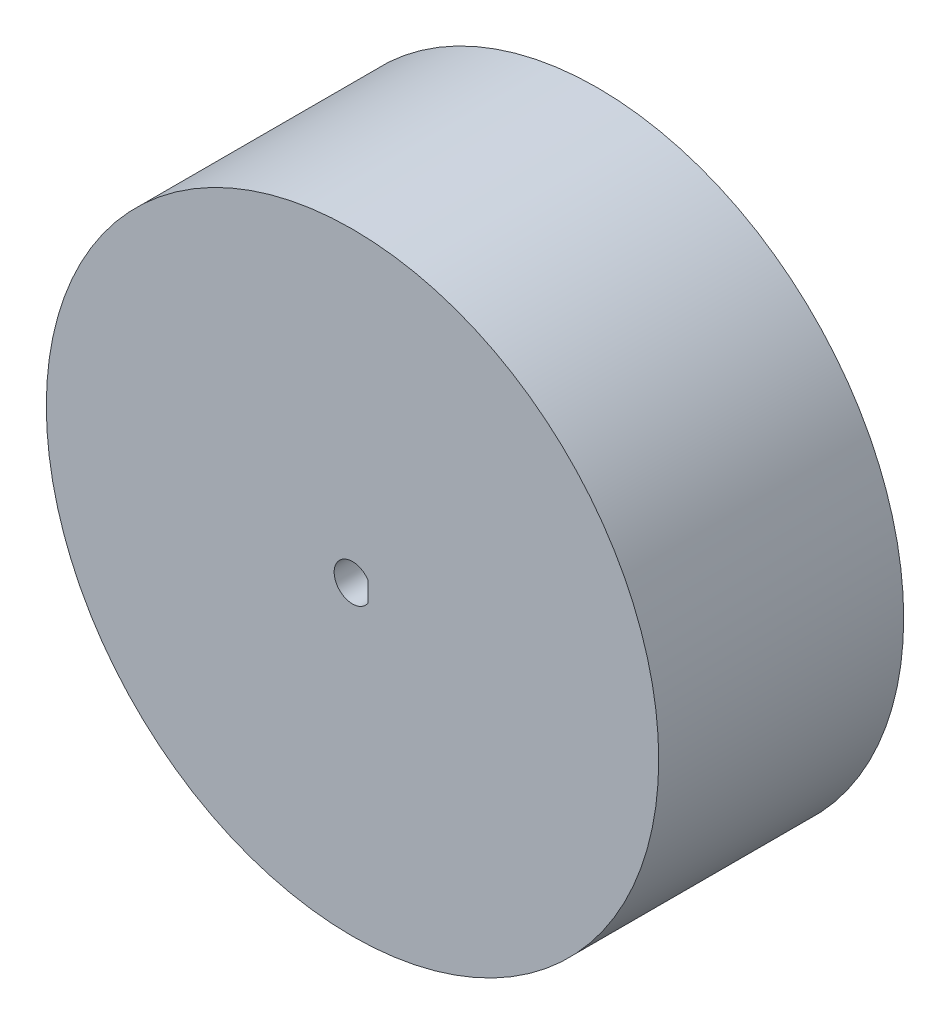
ISO-10303-21;
HEADER;
FILE_DESCRIPTION(('STEP AP214'),'2;1');
FILE_NAME('part.step','',(''),(''),'','','');
FILE_SCHEMA(('AUTOMOTIVE_DESIGN { 1 0 10303 214 1 1 1 1 }'));
ENDSEC;
DATA;
#1=APPLICATION_CONTEXT('core data for automotive mechanical design processes');
#2=APPLICATION_PROTOCOL_DEFINITION('international standard','automotive_design',2000,#1);
#3=PRODUCT_CONTEXT('',#1,'mechanical');
#4=PRODUCT('Part','Part','',(#3));
#5=PRODUCT_RELATED_PRODUCT_CATEGORY('part','',(#4));
#6=PRODUCT_DEFINITION_FORMATION('','',#4);
#7=PRODUCT_DEFINITION_CONTEXT('part definition',#1,'design');
#8=PRODUCT_DEFINITION('design','',#6,#7);
#9=PRODUCT_DEFINITION_SHAPE('','',#8);
#10=(LENGTH_UNIT() NAMED_UNIT(*) SI_UNIT(.MILLI.,.METRE.));
#11=(NAMED_UNIT(*) PLANE_ANGLE_UNIT() SI_UNIT($,.RADIAN.));
#12=(NAMED_UNIT(*) SI_UNIT($,.STERADIAN.) SOLID_ANGLE_UNIT());
#13=UNCERTAINTY_MEASURE_WITH_UNIT(LENGTH_MEASURE(1.E-05),#10,'distance_accuracy_value','');
#14=(GEOMETRIC_REPRESENTATION_CONTEXT(3) GLOBAL_UNCERTAINTY_ASSIGNED_CONTEXT((#13)) GLOBAL_UNIT_ASSIGNED_CONTEXT((#10,
#11,#12)) REPRESENTATION_CONTEXT('',''));
#15=CARTESIAN_POINT('',(0.,0.,0.));
#16=DIRECTION('',(0.,0.,1.));
#17=DIRECTION('',(1.,0.,0.));
#18=AXIS2_PLACEMENT_3D('',#15,#16,#17);
#19=CARTESIAN_POINT('',(0.,-6.99999999999998,40.));
#20=DIRECTION('',(0.,0.,1.));
#21=DIRECTION('',(1.,0.,0.));
#22=AXIS2_PLACEMENT_3D('',#19,#20,#21);
#23=PLANE('',#22);
#24=CARTESIAN_POINT('',(0.,-6.99999999999998,40.));
#25=DIRECTION('',(0.,0.,1.));
#26=DIRECTION('',(1.,0.,0.));
#27=AXIS2_PLACEMENT_3D('',#24,#25,#26);
#28=CIRCLE('',#27,50.);
#29=CARTESIAN_POINT('',(49.9999999999999,-6.99999999999998,40.));
#30=VERTEX_POINT('',#29);
#31=EDGE_CURVE('E12',#30,#30,#28,.T.);
#32=ORIENTED_EDGE('',*,*,#31,.T.);
#33=EDGE_LOOP('',(#32));
#34=FACE_BOUND('',#33,.T.);
#35=DIRECTION('',(0.,-1.,0.));
#36=VECTOR('',#35,1.);
#37=CARTESIAN_POINT('',(2.49999999999992,-5.34168760482228,40.));
#38=LINE('',#37,#36);
#39=CARTESIAN_POINT('',(2.49999999999992,-5.34168760482228,40.));
#40=VERTEX_POINT('',#39);
#41=CARTESIAN_POINT('',(2.49999999999992,-8.65831239517768,40.));
#42=VERTEX_POINT('',#41);
#43=EDGE_CURVE('E97',#40,#42,#38,.T.);
#44=ORIENTED_EDGE('',*,*,#43,.T.);
#45=CARTESIAN_POINT('',(0.,-6.99999999999998,40.));
#46=DIRECTION('',(0.,0.,1.));
#47=DIRECTION('',(1.,0.,0.));
#48=AXIS2_PLACEMENT_3D('',#45,#46,#47);
#49=CIRCLE('',#48,3.);
#50=EDGE_CURVE('E79',#40,#42,#49,.T.);
#51=ORIENTED_EDGE('',*,*,#50,.F.);
#52=EDGE_LOOP('',(#44,#51));
#53=FACE_BOUND('',#52,.T.);
#54=ADVANCED_FACE('F49',(#34,#53),#23,.T.);
#55=CARTESIAN_POINT('',(0.,-6.99999999999998,0.));
#56=DIRECTION('',(0.,0.,1.));
#57=DIRECTION('',(1.,0.,0.));
#58=AXIS2_PLACEMENT_3D('',#55,#56,#57);
#59=PLANE('',#58);
#60=CARTESIAN_POINT('',(0.,-6.99999999999998,0.));
#61=DIRECTION('',(0.,0.,1.));
#62=DIRECTION('',(1.,0.,0.));
#63=AXIS2_PLACEMENT_3D('',#60,#61,#62);
#64=CIRCLE('',#63,50.);
#65=CARTESIAN_POINT('',(49.9999999999999,-6.99999999999998,0.));
#66=VERTEX_POINT('',#65);
#67=EDGE_CURVE('E53',#66,#66,#64,.T.);
#68=ORIENTED_EDGE('',*,*,#67,.F.);
#69=EDGE_LOOP('',(#68));
#70=FACE_BOUND('',#69,.T.);
#71=CARTESIAN_POINT('',(0.,-6.99999999999998,0.));
#72=DIRECTION('',(0.,0.,1.));
#73=DIRECTION('',(1.,0.,0.));
#74=AXIS2_PLACEMENT_3D('',#71,#72,#73);
#75=CIRCLE('',#74,3.);
#76=CARTESIAN_POINT('',(2.49999999999992,-5.34168760482228,0.));
#77=VERTEX_POINT('',#76);
#78=CARTESIAN_POINT('',(2.49999999999992,-8.65831239517768,0.));
#79=VERTEX_POINT('',#78);
#80=EDGE_CURVE('E75',#77,#79,#75,.T.);
#81=ORIENTED_EDGE('',*,*,#80,.T.);
#82=DIRECTION('',(0.,-1.,0.));
#83=VECTOR('',#82,1.);
#84=CARTESIAN_POINT('',(2.49999999999992,-5.34168760482228,0.));
#85=LINE('',#84,#83);
#86=EDGE_CURVE('E86',#77,#79,#85,.T.);
#87=ORIENTED_EDGE('',*,*,#86,.F.);
#88=EDGE_LOOP('',(#81,#87));
#89=FACE_BOUND('',#88,.T.);
#90=ADVANCED_FACE('F91',(#70,#89),#59,.F.);
#91=CARTESIAN_POINT('',(0.,-6.99999999999998,40.));
#92=DIRECTION('',(0.,0.,-1.));
#93=DIRECTION('',(-1.,0.,0.));
#94=AXIS2_PLACEMENT_3D('',#91,#92,#93);
#95=CYLINDRICAL_SURFACE('',#94,50.);
#96=ORIENTED_EDGE('',*,*,#31,.F.);
#97=EDGE_LOOP('',(#96));
#98=FACE_BOUND('',#97,.T.);
#99=ORIENTED_EDGE('',*,*,#67,.T.);
#100=EDGE_LOOP('',(#99));
#101=FACE_BOUND('',#100,.T.);
#102=ADVANCED_FACE('F55',(#98,#101),#95,.T.);
#103=CARTESIAN_POINT('',(0.,-6.99999999999998,40.));
#104=DIRECTION('',(0.,0.,-1.));
#105=DIRECTION('',(-1.,0.,0.));
#106=AXIS2_PLACEMENT_3D('',#103,#104,#105);
#107=CYLINDRICAL_SURFACE('',#106,3.);
#108=ORIENTED_EDGE('',*,*,#80,.F.);
#109=DIRECTION('',(0.,0.,-1.));
#110=VECTOR('',#109,1.);
#111=CARTESIAN_POINT('',(2.49999999999992,-5.34168760482228,40.));
#112=LINE('',#111,#110);
#113=EDGE_CURVE('E81',#40,#77,#112,.T.);
#114=ORIENTED_EDGE('',*,*,#113,.F.);
#115=ORIENTED_EDGE('',*,*,#50,.T.);
#116=DIRECTION('',(0.,0.,-1.));
#117=VECTOR('',#116,1.);
#118=CARTESIAN_POINT('',(2.49999999999992,-8.65831239517768,40.));
#119=LINE('',#118,#117);
#120=EDGE_CURVE('E67',#42,#79,#119,.T.);
#121=ORIENTED_EDGE('',*,*,#120,.T.);
#122=EDGE_LOOP('',(#108,#114,#115,#121));
#123=FACE_BOUND('',#122,.T.);
#124=ADVANCED_FACE('F76',(#123),#107,.F.);
#125=CARTESIAN_POINT('',(2.49999999999992,-5.34168760482228,40.));
#126=DIRECTION('',(1.,0.,0.));
#127=DIRECTION('',(0.,1.,0.));
#128=AXIS2_PLACEMENT_3D('',#125,#126,#127);
#129=PLANE('',#128);
#130=ORIENTED_EDGE('',*,*,#86,.T.);
#131=ORIENTED_EDGE('',*,*,#120,.F.);
#132=ORIENTED_EDGE('',*,*,#43,.F.);
#133=ORIENTED_EDGE('',*,*,#113,.T.);
#134=EDGE_LOOP('',(#130,#131,#132,#133));
#135=FACE_BOUND('',#134,.T.);
#136=ADVANCED_FACE('F90',(#135),#129,.F.);
#137=CLOSED_SHELL('',(#54,#90,#102,#124,#136));
#138=MANIFOLD_SOLID_BREP('B2',#137);
#139=ADVANCED_BREP_SHAPE_REPRESENTATION('',(#18,#138),#14);
#140=SHAPE_DEFINITION_REPRESENTATION(#9,#139);
ENDSEC;
END-ISO-10303-21;
